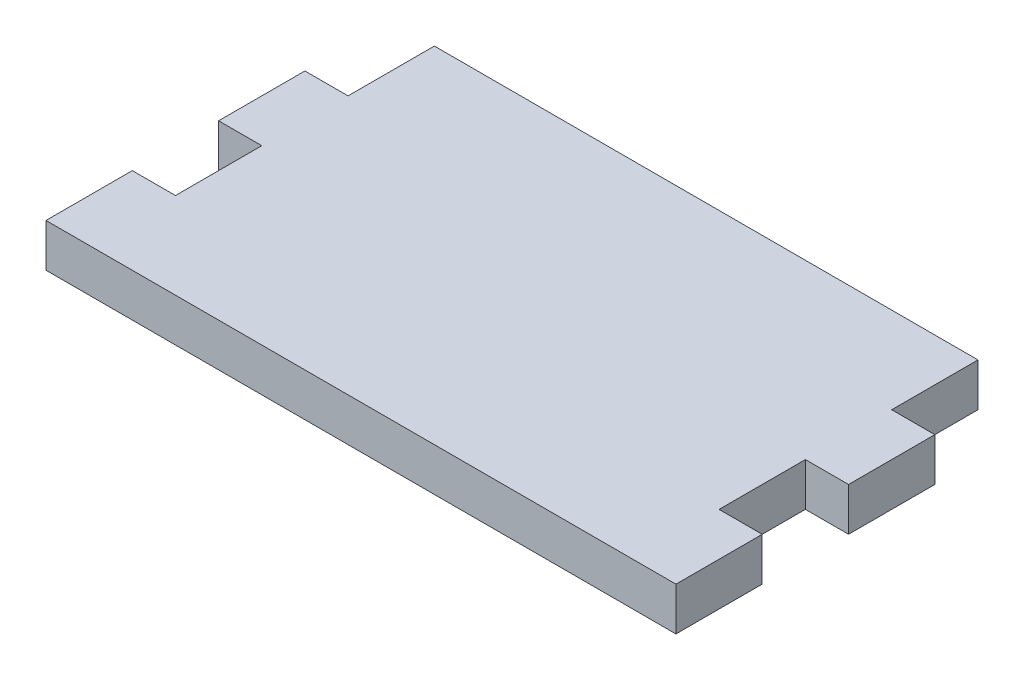
ISO-10303-21;
HEADER;
FILE_DESCRIPTION(('STEP AP214'),'2;1');
FILE_NAME('part.step','',(''),(''),'','','');
FILE_SCHEMA(('AUTOMOTIVE_DESIGN { 1 0 10303 214 1 1 1 1 }'));
ENDSEC;
DATA;
#1=APPLICATION_CONTEXT('core data for automotive mechanical design processes');
#2=APPLICATION_PROTOCOL_DEFINITION('international standard','automotive_design',2000,#1);
#3=PRODUCT_CONTEXT('',#1,'mechanical');
#4=PRODUCT('Part','Part','',(#3));
#5=PRODUCT_RELATED_PRODUCT_CATEGORY('part','',(#4));
#6=PRODUCT_DEFINITION_FORMATION('','',#4);
#7=PRODUCT_DEFINITION_CONTEXT('part definition',#1,'design');
#8=PRODUCT_DEFINITION('design','',#6,#7);
#9=PRODUCT_DEFINITION_SHAPE('','',#8);
#10=(LENGTH_UNIT() NAMED_UNIT(*) SI_UNIT(.MILLI.,.METRE.));
#11=(NAMED_UNIT(*) PLANE_ANGLE_UNIT() SI_UNIT($,.RADIAN.));
#12=(NAMED_UNIT(*) SI_UNIT($,.STERADIAN.) SOLID_ANGLE_UNIT());
#13=UNCERTAINTY_MEASURE_WITH_UNIT(LENGTH_MEASURE(1.E-05),#10,'distance_accuracy_value','');
#14=(GEOMETRIC_REPRESENTATION_CONTEXT(3) GLOBAL_UNCERTAINTY_ASSIGNED_CONTEXT((#13)) GLOBAL_UNIT_ASSIGNED_CONTEXT((#10,
#11,#12)) REPRESENTATION_CONTEXT('',''));
#15=CARTESIAN_POINT('',(0.,0.,0.));
#16=DIRECTION('',(0.,0.,1.));
#17=DIRECTION('',(1.,0.,0.));
#18=AXIS2_PLACEMENT_3D('',#15,#16,#17);
#19=CARTESIAN_POINT('',(46.35,3.175,0.));
#20=DIRECTION('',(0.,0.,-1.));
#21=DIRECTION('',(-1.,0.,0.));
#22=AXIS2_PLACEMENT_3D('',#19,#20,#21);
#23=PLANE('',#22);
#24=DIRECTION('',(1.,0.,0.));
#25=VECTOR('',#24,1.);
#26=CARTESIAN_POINT('',(46.35,0.,0.));
#27=LINE('',#26,#25);
#28=CARTESIAN_POINT('',(0.,0.,0.));
#29=VERTEX_POINT('',#28);
#30=CARTESIAN_POINT('',(46.35,0.,0.));
#31=VERTEX_POINT('',#30);
#32=EDGE_CURVE('E177',#29,#31,#27,.T.);
#33=ORIENTED_EDGE('',*,*,#32,.T.);
#34=DIRECTION('',(0.,-1.,0.));
#35=VECTOR('',#34,1.);
#36=CARTESIAN_POINT('',(46.35,3.175,0.));
#37=LINE('',#36,#35);
#38=CARTESIAN_POINT('',(46.35,3.175,0.));
#39=VERTEX_POINT('',#38);
#40=EDGE_CURVE('E11',#39,#31,#37,.T.);
#41=ORIENTED_EDGE('',*,*,#40,.F.);
#42=DIRECTION('',(1.,0.,0.));
#43=VECTOR('',#42,1.);
#44=CARTESIAN_POINT('',(46.35,3.175,0.));
#45=LINE('',#44,#43);
#46=CARTESIAN_POINT('',(0.,3.175,0.));
#47=VERTEX_POINT('',#46);
#48=EDGE_CURVE('E207',#47,#39,#45,.T.);
#49=ORIENTED_EDGE('',*,*,#48,.F.);
#50=DIRECTION('',(0.,-1.,0.));
#51=VECTOR('',#50,1.);
#52=CARTESIAN_POINT('',(0.,3.175,0.));
#53=LINE('',#52,#51);
#54=EDGE_CURVE('E173',#47,#29,#53,.T.);
#55=ORIENTED_EDGE('',*,*,#54,.T.);
#56=EDGE_LOOP('',(#33,#41,#49,#55));
#57=FACE_BOUND('',#56,.T.);
#58=ADVANCED_FACE('F33',(#57),#23,.F.);
#59=CARTESIAN_POINT('',(46.35,3.175,-6.35));
#60=DIRECTION('',(-1.,0.,0.));
#61=DIRECTION('',(0.,0.,1.));
#62=AXIS2_PLACEMENT_3D('',#59,#60,#61);
#63=PLANE('',#62);
#64=DIRECTION('',(0.,0.,-1.));
#65=VECTOR('',#64,1.);
#66=CARTESIAN_POINT('',(46.35,0.,-6.35));
#67=LINE('',#66,#65);
#68=CARTESIAN_POINT('',(46.35,0.,-6.35));
#69=VERTEX_POINT('',#68);
#70=EDGE_CURVE('E180',#31,#69,#67,.T.);
#71=ORIENTED_EDGE('',*,*,#70,.T.);
#72=DIRECTION('',(0.,-1.,0.));
#73=VECTOR('',#72,1.);
#74=CARTESIAN_POINT('',(46.35,3.175,-6.35));
#75=LINE('',#74,#73);
#76=CARTESIAN_POINT('',(46.35,3.175,-6.35));
#77=VERTEX_POINT('',#76);
#78=EDGE_CURVE('E41',#77,#69,#75,.T.);
#79=ORIENTED_EDGE('',*,*,#78,.F.);
#80=DIRECTION('',(0.,0.,-1.));
#81=VECTOR('',#80,1.);
#82=CARTESIAN_POINT('',(46.35,3.175,-6.35));
#83=LINE('',#82,#81);
#84=EDGE_CURVE('E116',#39,#77,#83,.T.);
#85=ORIENTED_EDGE('',*,*,#84,.F.);
#86=ORIENTED_EDGE('',*,*,#40,.T.);
#87=EDGE_LOOP('',(#71,#79,#85,#86));
#88=FACE_BOUND('',#87,.T.);
#89=ADVANCED_FACE('F305',(#88),#63,.F.);
#90=CARTESIAN_POINT('',(43.175,3.175,-6.35));
#91=DIRECTION('',(0.,0.,1.));
#92=DIRECTION('',(1.,0.,0.));
#93=AXIS2_PLACEMENT_3D('',#90,#91,#92);
#94=PLANE('',#93);
#95=DIRECTION('',(-1.,0.,0.));
#96=VECTOR('',#95,1.);
#97=CARTESIAN_POINT('',(43.175,0.,-6.35));
#98=LINE('',#97,#96);
#99=CARTESIAN_POINT('',(43.175,0.,-6.35));
#100=VERTEX_POINT('',#99);
#101=EDGE_CURVE('E182',#69,#100,#98,.T.);
#102=ORIENTED_EDGE('',*,*,#101,.T.);
#103=DIRECTION('',(0.,-1.,0.));
#104=VECTOR('',#103,1.);
#105=CARTESIAN_POINT('',(43.175,3.175,-6.35));
#106=LINE('',#105,#104);
#107=CARTESIAN_POINT('',(43.175,3.175,-6.35));
#108=VERTEX_POINT('',#107);
#109=EDGE_CURVE('E238',#108,#100,#106,.T.);
#110=ORIENTED_EDGE('',*,*,#109,.F.);
#111=DIRECTION('',(-1.,0.,0.));
#112=VECTOR('',#111,1.);
#113=CARTESIAN_POINT('',(43.175,3.175,-6.35));
#114=LINE('',#113,#112);
#115=EDGE_CURVE('E246',#77,#108,#114,.T.);
#116=ORIENTED_EDGE('',*,*,#115,.F.);
#117=ORIENTED_EDGE('',*,*,#78,.T.);
#118=EDGE_LOOP('',(#102,#110,#116,#117));
#119=FACE_BOUND('',#118,.T.);
#120=ADVANCED_FACE('F244',(#119),#94,.F.);
#121=CARTESIAN_POINT('',(43.175,3.175,-12.7));
#122=DIRECTION('',(-1.,0.,0.));
#123=DIRECTION('',(0.,0.,1.));
#124=AXIS2_PLACEMENT_3D('',#121,#122,#123);
#125=PLANE('',#124);
#126=DIRECTION('',(0.,0.,-1.));
#127=VECTOR('',#126,1.);
#128=CARTESIAN_POINT('',(43.175,0.,-12.7));
#129=LINE('',#128,#127);
#130=CARTESIAN_POINT('',(43.175,0.,-12.7));
#131=VERTEX_POINT('',#130);
#132=EDGE_CURVE('E184',#100,#131,#129,.T.);
#133=ORIENTED_EDGE('',*,*,#132,.T.);
#134=DIRECTION('',(0.,-1.,0.));
#135=VECTOR('',#134,1.);
#136=CARTESIAN_POINT('',(43.175,3.175,-12.7));
#137=LINE('',#136,#135);
#138=CARTESIAN_POINT('',(43.175,3.175,-12.7));
#139=VERTEX_POINT('',#138);
#140=EDGE_CURVE('E235',#139,#131,#137,.T.);
#141=ORIENTED_EDGE('',*,*,#140,.F.);
#142=DIRECTION('',(0.,0.,-1.));
#143=VECTOR('',#142,1.);
#144=CARTESIAN_POINT('',(43.175,3.175,-12.7));
#145=LINE('',#144,#143);
#146=EDGE_CURVE('E264',#108,#139,#145,.T.);
#147=ORIENTED_EDGE('',*,*,#146,.F.);
#148=ORIENTED_EDGE('',*,*,#109,.T.);
#149=EDGE_LOOP('',(#133,#141,#147,#148));
#150=FACE_BOUND('',#149,.T.);
#151=ADVANCED_FACE('F255',(#150),#125,.F.);
#152=CARTESIAN_POINT('',(46.35,3.175,-12.7));
#153=DIRECTION('',(0.,0.,-1.));
#154=DIRECTION('',(-1.,0.,0.));
#155=AXIS2_PLACEMENT_3D('',#152,#153,#154);
#156=PLANE('',#155);
#157=DIRECTION('',(1.,0.,0.));
#158=VECTOR('',#157,1.);
#159=CARTESIAN_POINT('',(46.35,0.,-12.7));
#160=LINE('',#159,#158);
#161=CARTESIAN_POINT('',(46.35,0.,-12.7));
#162=VERTEX_POINT('',#161);
#163=EDGE_CURVE('E186',#131,#162,#160,.T.);
#164=ORIENTED_EDGE('',*,*,#163,.T.);
#165=DIRECTION('',(0.,-1.,0.));
#166=VECTOR('',#165,1.);
#167=CARTESIAN_POINT('',(46.35,3.175,-12.7));
#168=LINE('',#167,#166);
#169=CARTESIAN_POINT('',(46.35,3.175,-12.7));
#170=VERTEX_POINT('',#169);
#171=EDGE_CURVE('E232',#170,#162,#168,.T.);
#172=ORIENTED_EDGE('',*,*,#171,.F.);
#173=DIRECTION('',(1.,0.,0.));
#174=VECTOR('',#173,1.);
#175=CARTESIAN_POINT('',(46.35,3.175,-12.7));
#176=LINE('',#175,#174);
#177=EDGE_CURVE('E261',#139,#170,#176,.T.);
#178=ORIENTED_EDGE('',*,*,#177,.F.);
#179=ORIENTED_EDGE('',*,*,#140,.T.);
#180=EDGE_LOOP('',(#164,#172,#178,#179));
#181=FACE_BOUND('',#180,.T.);
#182=ADVANCED_FACE('F259',(#181),#156,.F.);
#183=CARTESIAN_POINT('',(46.35,3.175,-19.05));
#184=DIRECTION('',(-1.,0.,0.));
#185=DIRECTION('',(0.,0.,1.));
#186=AXIS2_PLACEMENT_3D('',#183,#184,#185);
#187=PLANE('',#186);
#188=DIRECTION('',(0.,0.,-1.));
#189=VECTOR('',#188,1.);
#190=CARTESIAN_POINT('',(46.35,0.,-19.05));
#191=LINE('',#190,#189);
#192=CARTESIAN_POINT('',(46.35,0.,-19.05));
#193=VERTEX_POINT('',#192);
#194=EDGE_CURVE('E188',#162,#193,#191,.T.);
#195=ORIENTED_EDGE('',*,*,#194,.T.);
#196=DIRECTION('',(0.,-1.,0.));
#197=VECTOR('',#196,1.);
#198=CARTESIAN_POINT('',(46.35,3.175,-19.05));
#199=LINE('',#198,#197);
#200=CARTESIAN_POINT('',(46.35,3.175,-19.05));
#201=VERTEX_POINT('',#200);
#202=EDGE_CURVE('E229',#201,#193,#199,.T.);
#203=ORIENTED_EDGE('',*,*,#202,.F.);
#204=DIRECTION('',(0.,0.,-1.));
#205=VECTOR('',#204,1.);
#206=CARTESIAN_POINT('',(46.35,3.175,-19.05));
#207=LINE('',#206,#205);
#208=EDGE_CURVE('E263',#170,#201,#207,.T.);
#209=ORIENTED_EDGE('',*,*,#208,.F.);
#210=ORIENTED_EDGE('',*,*,#171,.T.);
#211=EDGE_LOOP('',(#195,#203,#209,#210));
#212=FACE_BOUND('',#211,.T.);
#213=ADVANCED_FACE('F318',(#212),#187,.F.);
#214=CARTESIAN_POINT('',(43.175,3.175,-19.05));
#215=DIRECTION('',(0.,0.,1.));
#216=DIRECTION('',(1.,0.,0.));
#217=AXIS2_PLACEMENT_3D('',#214,#215,#216);
#218=PLANE('',#217);
#219=DIRECTION('',(-1.,0.,0.));
#220=VECTOR('',#219,1.);
#221=CARTESIAN_POINT('',(43.175,0.,-19.05));
#222=LINE('',#221,#220);
#223=CARTESIAN_POINT('',(43.175,0.,-19.05));
#224=VERTEX_POINT('',#223);
#225=EDGE_CURVE('E190',#193,#224,#222,.T.);
#226=ORIENTED_EDGE('',*,*,#225,.T.);
#227=DIRECTION('',(0.,-1.,0.));
#228=VECTOR('',#227,1.);
#229=CARTESIAN_POINT('',(43.175,3.175,-19.05));
#230=LINE('',#229,#228);
#231=CARTESIAN_POINT('',(43.175,3.175,-19.05));
#232=VERTEX_POINT('',#231);
#233=EDGE_CURVE('E226',#232,#224,#230,.T.);
#234=ORIENTED_EDGE('',*,*,#233,.F.);
#235=DIRECTION('',(-1.,0.,0.));
#236=VECTOR('',#235,1.);
#237=CARTESIAN_POINT('',(43.175,3.175,-19.05));
#238=LINE('',#237,#236);
#239=EDGE_CURVE('E266',#201,#232,#238,.T.);
#240=ORIENTED_EDGE('',*,*,#239,.F.);
#241=ORIENTED_EDGE('',*,*,#202,.T.);
#242=EDGE_LOOP('',(#226,#234,#240,#241));
#243=FACE_BOUND('',#242,.T.);
#244=ADVANCED_FACE('F321',(#243),#218,.F.);
#245=CARTESIAN_POINT('',(43.175,3.175,-25.4));
#246=DIRECTION('',(-1.,0.,0.));
#247=DIRECTION('',(0.,0.,1.));
#248=AXIS2_PLACEMENT_3D('',#245,#246,#247);
#249=PLANE('',#248);
#250=DIRECTION('',(0.,0.,-1.));
#251=VECTOR('',#250,1.);
#252=CARTESIAN_POINT('',(43.175,0.,-25.4));
#253=LINE('',#252,#251);
#254=CARTESIAN_POINT('',(43.175,0.,-25.4));
#255=VERTEX_POINT('',#254);
#256=EDGE_CURVE('E192',#224,#255,#253,.T.);
#257=ORIENTED_EDGE('',*,*,#256,.T.);
#258=DIRECTION('',(0.,-1.,0.));
#259=VECTOR('',#258,1.);
#260=CARTESIAN_POINT('',(43.175,3.175,-25.4));
#261=LINE('',#260,#259);
#262=CARTESIAN_POINT('',(43.175,3.175,-25.4));
#263=VERTEX_POINT('',#262);
#264=EDGE_CURVE('E223',#263,#255,#261,.T.);
#265=ORIENTED_EDGE('',*,*,#264,.F.);
#266=DIRECTION('',(0.,0.,-1.));
#267=VECTOR('',#266,1.);
#268=CARTESIAN_POINT('',(43.175,3.175,-25.4));
#269=LINE('',#268,#267);
#270=EDGE_CURVE('E272',#232,#263,#269,.T.);
#271=ORIENTED_EDGE('',*,*,#270,.F.);
#272=ORIENTED_EDGE('',*,*,#233,.T.);
#273=EDGE_LOOP('',(#257,#265,#271,#272));
#274=FACE_BOUND('',#273,.T.);
#275=ADVANCED_FACE('F325',(#274),#249,.F.);
#276=CARTESIAN_POINT('',(3.175,3.175,-25.4));
#277=DIRECTION('',(0.,0.,1.));
#278=DIRECTION('',(1.,0.,0.));
#279=AXIS2_PLACEMENT_3D('',#276,#277,#278);
#280=PLANE('',#279);
#281=DIRECTION('',(-1.,0.,0.));
#282=VECTOR('',#281,1.);
#283=CARTESIAN_POINT('',(3.175,0.,-25.4));
#284=LINE('',#283,#282);
#285=CARTESIAN_POINT('',(3.175,0.,-25.4));
#286=VERTEX_POINT('',#285);
#287=EDGE_CURVE('E194',#255,#286,#284,.T.);
#288=ORIENTED_EDGE('',*,*,#287,.T.);
#289=DIRECTION('',(0.,-1.,0.));
#290=VECTOR('',#289,1.);
#291=CARTESIAN_POINT('',(3.175,3.175,-25.4));
#292=LINE('',#291,#290);
#293=CARTESIAN_POINT('',(3.175,3.175,-25.4));
#294=VERTEX_POINT('',#293);
#295=EDGE_CURVE('E220',#294,#286,#292,.T.);
#296=ORIENTED_EDGE('',*,*,#295,.F.);
#297=DIRECTION('',(-1.,0.,0.));
#298=VECTOR('',#297,1.);
#299=CARTESIAN_POINT('',(3.175,3.175,-25.4));
#300=LINE('',#299,#298);
#301=EDGE_CURVE('E274',#263,#294,#300,.T.);
#302=ORIENTED_EDGE('',*,*,#301,.F.);
#303=ORIENTED_EDGE('',*,*,#264,.T.);
#304=EDGE_LOOP('',(#288,#296,#302,#303));
#305=FACE_BOUND('',#304,.T.);
#306=ADVANCED_FACE('F329',(#305),#280,.F.);
#307=CARTESIAN_POINT('',(3.175,3.175,-19.05));
#308=DIRECTION('',(1.,0.,0.));
#309=DIRECTION('',(0.,0.,-1.));
#310=AXIS2_PLACEMENT_3D('',#307,#308,#309);
#311=PLANE('',#310);
#312=DIRECTION('',(0.,0.,1.));
#313=VECTOR('',#312,1.);
#314=CARTESIAN_POINT('',(3.175,0.,-19.05));
#315=LINE('',#314,#313);
#316=CARTESIAN_POINT('',(3.175,0.,-19.05));
#317=VERTEX_POINT('',#316);
#318=EDGE_CURVE('E196',#286,#317,#315,.T.);
#319=ORIENTED_EDGE('',*,*,#318,.T.);
#320=DIRECTION('',(0.,-1.,0.));
#321=VECTOR('',#320,1.);
#322=CARTESIAN_POINT('',(3.175,3.175,-19.05));
#323=LINE('',#322,#321);
#324=CARTESIAN_POINT('',(3.175,3.175,-19.05));
#325=VERTEX_POINT('',#324);
#326=EDGE_CURVE('E217',#325,#317,#323,.T.);
#327=ORIENTED_EDGE('',*,*,#326,.F.);
#328=DIRECTION('',(0.,0.,1.));
#329=VECTOR('',#328,1.);
#330=CARTESIAN_POINT('',(3.175,3.175,-19.05));
#331=LINE('',#330,#329);
#332=EDGE_CURVE('E276',#294,#325,#331,.T.);
#333=ORIENTED_EDGE('',*,*,#332,.F.);
#334=ORIENTED_EDGE('',*,*,#295,.T.);
#335=EDGE_LOOP('',(#319,#327,#333,#334));
#336=FACE_BOUND('',#335,.T.);
#337=ADVANCED_FACE('F333',(#336),#311,.F.);
#338=CARTESIAN_POINT('',(0.,3.175,-19.05));
#339=DIRECTION('',(0.,0.,1.));
#340=DIRECTION('',(1.,0.,0.));
#341=AXIS2_PLACEMENT_3D('',#338,#339,#340);
#342=PLANE('',#341);
#343=DIRECTION('',(-1.,0.,0.));
#344=VECTOR('',#343,1.);
#345=CARTESIAN_POINT('',(0.,0.,-19.05));
#346=LINE('',#345,#344);
#347=CARTESIAN_POINT('',(0.,0.,-19.05));
#348=VERTEX_POINT('',#347);
#349=EDGE_CURVE('E198',#317,#348,#346,.T.);
#350=ORIENTED_EDGE('',*,*,#349,.T.);
#351=DIRECTION('',(0.,-1.,0.));
#352=VECTOR('',#351,1.);
#353=CARTESIAN_POINT('',(0.,3.175,-19.05));
#354=LINE('',#353,#352);
#355=CARTESIAN_POINT('',(0.,3.175,-19.05));
#356=VERTEX_POINT('',#355);
#357=EDGE_CURVE('E214',#356,#348,#354,.T.);
#358=ORIENTED_EDGE('',*,*,#357,.F.);
#359=DIRECTION('',(-1.,0.,0.));
#360=VECTOR('',#359,1.);
#361=CARTESIAN_POINT('',(0.,3.175,-19.05));
#362=LINE('',#361,#360);
#363=EDGE_CURVE('E278',#325,#356,#362,.T.);
#364=ORIENTED_EDGE('',*,*,#363,.F.);
#365=ORIENTED_EDGE('',*,*,#326,.T.);
#366=EDGE_LOOP('',(#350,#358,#364,#365));
#367=FACE_BOUND('',#366,.T.);
#368=ADVANCED_FACE('F337',(#367),#342,.F.);
#369=CARTESIAN_POINT('',(0.,3.175,-12.7));
#370=DIRECTION('',(1.,0.,0.));
#371=DIRECTION('',(0.,0.,-1.));
#372=AXIS2_PLACEMENT_3D('',#369,#370,#371);
#373=PLANE('',#372);
#374=DIRECTION('',(0.,0.,1.));
#375=VECTOR('',#374,1.);
#376=CARTESIAN_POINT('',(0.,0.,-12.7));
#377=LINE('',#376,#375);
#378=CARTESIAN_POINT('',(0.,0.,-12.7));
#379=VERTEX_POINT('',#378);
#380=EDGE_CURVE('E200',#348,#379,#377,.T.);
#381=ORIENTED_EDGE('',*,*,#380,.T.);
#382=DIRECTION('',(0.,-1.,0.));
#383=VECTOR('',#382,1.);
#384=CARTESIAN_POINT('',(0.,3.175,-12.7));
#385=LINE('',#384,#383);
#386=CARTESIAN_POINT('',(0.,3.175,-12.7));
#387=VERTEX_POINT('',#386);
#388=EDGE_CURVE('E211',#387,#379,#385,.T.);
#389=ORIENTED_EDGE('',*,*,#388,.F.);
#390=DIRECTION('',(0.,0.,1.));
#391=VECTOR('',#390,1.);
#392=CARTESIAN_POINT('',(0.,3.175,-12.7));
#393=LINE('',#392,#391);
#394=EDGE_CURVE('E280',#356,#387,#393,.T.);
#395=ORIENTED_EDGE('',*,*,#394,.F.);
#396=ORIENTED_EDGE('',*,*,#357,.T.);
#397=EDGE_LOOP('',(#381,#389,#395,#396));
#398=FACE_BOUND('',#397,.T.);
#399=ADVANCED_FACE('F286',(#398),#373,.F.);
#400=CARTESIAN_POINT('',(3.175,3.175,-12.7));
#401=DIRECTION('',(0.,0.,-1.));
#402=DIRECTION('',(-1.,0.,0.));
#403=AXIS2_PLACEMENT_3D('',#400,#401,#402);
#404=PLANE('',#403);
#405=DIRECTION('',(1.,0.,0.));
#406=VECTOR('',#405,1.);
#407=CARTESIAN_POINT('',(3.175,0.,-12.7));
#408=LINE('',#407,#406);
#409=CARTESIAN_POINT('',(3.175,0.,-12.7));
#410=VERTEX_POINT('',#409);
#411=EDGE_CURVE('E202',#379,#410,#408,.T.);
#412=ORIENTED_EDGE('',*,*,#411,.T.);
#413=DIRECTION('',(0.,-1.,0.));
#414=VECTOR('',#413,1.);
#415=CARTESIAN_POINT('',(3.175,3.175,-12.7));
#416=LINE('',#415,#414);
#417=CARTESIAN_POINT('',(3.175,3.175,-12.7));
#418=VERTEX_POINT('',#417);
#419=EDGE_CURVE('E168',#418,#410,#416,.T.);
#420=ORIENTED_EDGE('',*,*,#419,.F.);
#421=DIRECTION('',(1.,0.,0.));
#422=VECTOR('',#421,1.);
#423=CARTESIAN_POINT('',(3.175,3.175,-12.7));
#424=LINE('',#423,#422);
#425=EDGE_CURVE('E159',#387,#418,#424,.T.);
#426=ORIENTED_EDGE('',*,*,#425,.F.);
#427=ORIENTED_EDGE('',*,*,#388,.T.);
#428=EDGE_LOOP('',(#412,#420,#426,#427));
#429=FACE_BOUND('',#428,.T.);
#430=ADVANCED_FACE('F290',(#429),#404,.F.);
#431=CARTESIAN_POINT('',(3.175,3.175,-6.35));
#432=DIRECTION('',(1.,0.,0.));
#433=DIRECTION('',(0.,0.,-1.));
#434=AXIS2_PLACEMENT_3D('',#431,#432,#433);
#435=PLANE('',#434);
#436=DIRECTION('',(0.,0.,1.));
#437=VECTOR('',#436,1.);
#438=CARTESIAN_POINT('',(3.175,0.,-6.35));
#439=LINE('',#438,#437);
#440=CARTESIAN_POINT('',(3.175,0.,-6.35));
#441=VERTEX_POINT('',#440);
#442=EDGE_CURVE('E167',#410,#441,#439,.T.);
#443=ORIENTED_EDGE('',*,*,#442,.T.);
#444=DIRECTION('',(0.,-1.,0.));
#445=VECTOR('',#444,1.);
#446=CARTESIAN_POINT('',(3.175,3.175,-6.35));
#447=LINE('',#446,#445);
#448=CARTESIAN_POINT('',(3.175,3.175,-6.35));
#449=VERTEX_POINT('',#448);
#450=EDGE_CURVE('E164',#449,#441,#447,.T.);
#451=ORIENTED_EDGE('',*,*,#450,.F.);
#452=DIRECTION('',(0.,0.,1.));
#453=VECTOR('',#452,1.);
#454=CARTESIAN_POINT('',(3.175,3.175,-6.35));
#455=LINE('',#454,#453);
#456=EDGE_CURVE('E153',#418,#449,#455,.T.);
#457=ORIENTED_EDGE('',*,*,#456,.F.);
#458=ORIENTED_EDGE('',*,*,#419,.T.);
#459=EDGE_LOOP('',(#443,#451,#457,#458));
#460=FACE_BOUND('',#459,.T.);
#461=ADVANCED_FACE('F165',(#460),#435,.F.);
#462=CARTESIAN_POINT('',(0.,3.175,-6.35));
#463=DIRECTION('',(0.,0.,1.));
#464=DIRECTION('',(1.,0.,0.));
#465=AXIS2_PLACEMENT_3D('',#462,#463,#464);
#466=PLANE('',#465);
#467=DIRECTION('',(-1.,0.,0.));
#468=VECTOR('',#467,1.);
#469=CARTESIAN_POINT('',(0.,0.,-6.35));
#470=LINE('',#469,#468);
#471=CARTESIAN_POINT('',(0.,0.,-6.35));
#472=VERTEX_POINT('',#471);
#473=EDGE_CURVE('E102',#441,#472,#470,.T.);
#474=ORIENTED_EDGE('',*,*,#473,.T.);
#475=DIRECTION('',(0.,-1.,0.));
#476=VECTOR('',#475,1.);
#477=CARTESIAN_POINT('',(0.,3.175,-6.35));
#478=LINE('',#477,#476);
#479=CARTESIAN_POINT('',(0.,3.175,-6.35));
#480=VERTEX_POINT('',#479);
#481=EDGE_CURVE('E169',#480,#472,#478,.T.);
#482=ORIENTED_EDGE('',*,*,#481,.F.);
#483=DIRECTION('',(-1.,0.,0.));
#484=VECTOR('',#483,1.);
#485=CARTESIAN_POINT('',(0.,3.175,-6.35));
#486=LINE('',#485,#484);
#487=EDGE_CURVE('E157',#449,#480,#486,.T.);
#488=ORIENTED_EDGE('',*,*,#487,.F.);
#489=ORIENTED_EDGE('',*,*,#450,.T.);
#490=EDGE_LOOP('',(#474,#482,#488,#489));
#491=FACE_BOUND('',#490,.T.);
#492=ADVANCED_FACE('F171',(#491),#466,.F.);
#493=CARTESIAN_POINT('',(0.,3.175,0.));
#494=DIRECTION('',(1.,0.,0.));
#495=DIRECTION('',(0.,0.,-1.));
#496=AXIS2_PLACEMENT_3D('',#493,#494,#495);
#497=PLANE('',#496);
#498=DIRECTION('',(0.,0.,1.));
#499=VECTOR('',#498,1.);
#500=CARTESIAN_POINT('',(0.,0.,0.));
#501=LINE('',#500,#499);
#502=EDGE_CURVE('E108',#472,#29,#501,.T.);
#503=ORIENTED_EDGE('',*,*,#502,.T.);
#504=ORIENTED_EDGE('',*,*,#54,.F.);
#505=DIRECTION('',(0.,0.,1.));
#506=VECTOR('',#505,1.);
#507=CARTESIAN_POINT('',(0.,3.175,0.));
#508=LINE('',#507,#506);
#509=EDGE_CURVE('E49',#480,#47,#508,.T.);
#510=ORIENTED_EDGE('',*,*,#509,.F.);
#511=ORIENTED_EDGE('',*,*,#481,.T.);
#512=EDGE_LOOP('',(#503,#504,#510,#511));
#513=FACE_BOUND('',#512,.T.);
#514=ADVANCED_FACE('F294',(#513),#497,.F.);
#515=CARTESIAN_POINT('',(0.,3.175,0.));
#516=DIRECTION('',(0.,-1.,0.));
#517=DIRECTION('',(0.,0.,-1.));
#518=AXIS2_PLACEMENT_3D('',#515,#516,#517);
#519=PLANE('',#518);
#520=ORIENTED_EDGE('',*,*,#48,.T.);
#521=ORIENTED_EDGE('',*,*,#84,.T.);
#522=ORIENTED_EDGE('',*,*,#115,.T.);
#523=ORIENTED_EDGE('',*,*,#146,.T.);
#524=ORIENTED_EDGE('',*,*,#177,.T.);
#525=ORIENTED_EDGE('',*,*,#208,.T.);
#526=ORIENTED_EDGE('',*,*,#239,.T.);
#527=ORIENTED_EDGE('',*,*,#270,.T.);
#528=ORIENTED_EDGE('',*,*,#301,.T.);
#529=ORIENTED_EDGE('',*,*,#332,.T.);
#530=ORIENTED_EDGE('',*,*,#363,.T.);
#531=ORIENTED_EDGE('',*,*,#394,.T.);
#532=ORIENTED_EDGE('',*,*,#425,.T.);
#533=ORIENTED_EDGE('',*,*,#456,.T.);
#534=ORIENTED_EDGE('',*,*,#487,.T.);
#535=ORIENTED_EDGE('',*,*,#509,.T.);
#536=EDGE_LOOP('',(#520,#521,#522,#523,#524,#525,#526,#527,#528,#529,#530,#531,#532,#533,#534,#535));
#537=FACE_BOUND('',#536,.T.);
#538=ADVANCED_FACE('F155',(#537),#519,.F.);
#539=CARTESIAN_POINT('',(0.,0.,0.));
#540=DIRECTION('',(0.,-1.,0.));
#541=DIRECTION('',(0.,0.,-1.));
#542=AXIS2_PLACEMENT_3D('',#539,#540,#541);
#543=PLANE('',#542);
#544=ORIENTED_EDGE('',*,*,#32,.F.);
#545=ORIENTED_EDGE('',*,*,#502,.F.);
#546=ORIENTED_EDGE('',*,*,#473,.F.);
#547=ORIENTED_EDGE('',*,*,#442,.F.);
#548=ORIENTED_EDGE('',*,*,#411,.F.);
#549=ORIENTED_EDGE('',*,*,#380,.F.);
#550=ORIENTED_EDGE('',*,*,#349,.F.);
#551=ORIENTED_EDGE('',*,*,#318,.F.);
#552=ORIENTED_EDGE('',*,*,#287,.F.);
#553=ORIENTED_EDGE('',*,*,#256,.F.);
#554=ORIENTED_EDGE('',*,*,#225,.F.);
#555=ORIENTED_EDGE('',*,*,#194,.F.);
#556=ORIENTED_EDGE('',*,*,#163,.F.);
#557=ORIENTED_EDGE('',*,*,#132,.F.);
#558=ORIENTED_EDGE('',*,*,#101,.F.);
#559=ORIENTED_EDGE('',*,*,#70,.F.);
#560=EDGE_LOOP('',(#544,#545,#546,#547,#548,#549,#550,#551,#552,#553,#554,#555,#556,#557,#558,#559));
#561=FACE_BOUND('',#560,.T.);
#562=ADVANCED_FACE('F250',(#561),#543,.T.);
#563=CLOSED_SHELL('',(#58,#89,#120,#151,#182,#213,#244,#275,#306,#337,#368,#399,#430,#461,#492,
#514,#538,#562));
#564=MANIFOLD_SOLID_BREP('B2',#563);
#565=ADVANCED_BREP_SHAPE_REPRESENTATION('',(#18,#564),#14);
#566=SHAPE_DEFINITION_REPRESENTATION(#9,#565);
ENDSEC;
END-ISO-10303-21;
